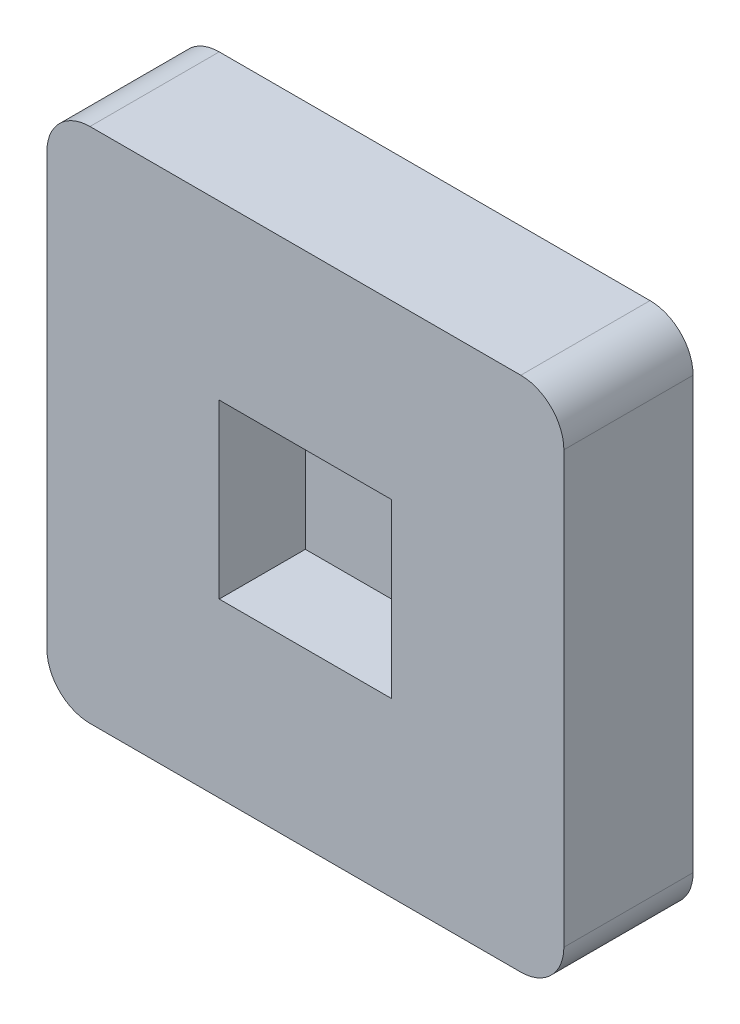
ISO-10303-21;
HEADER;
FILE_DESCRIPTION(('STEP AP214'),'2;1');
FILE_NAME('part.step','',(''),(''),'','','');
FILE_SCHEMA(('AUTOMOTIVE_DESIGN { 1 0 10303 214 1 1 1 1 }'));
ENDSEC;
DATA;
#1=APPLICATION_CONTEXT('core data for automotive mechanical design processes');
#2=APPLICATION_PROTOCOL_DEFINITION('international standard','automotive_design',2000,#1);
#3=PRODUCT_CONTEXT('',#1,'mechanical');
#4=PRODUCT('Part','Part','',(#3));
#5=PRODUCT_RELATED_PRODUCT_CATEGORY('part','',(#4));
#6=PRODUCT_DEFINITION_FORMATION('','',#4);
#7=PRODUCT_DEFINITION_CONTEXT('part definition',#1,'design');
#8=PRODUCT_DEFINITION('design','',#6,#7);
#9=PRODUCT_DEFINITION_SHAPE('','',#8);
#10=(LENGTH_UNIT() NAMED_UNIT(*) SI_UNIT(.MILLI.,.METRE.));
#11=(NAMED_UNIT(*) PLANE_ANGLE_UNIT() SI_UNIT($,.RADIAN.));
#12=(NAMED_UNIT(*) SI_UNIT($,.STERADIAN.) SOLID_ANGLE_UNIT());
#13=UNCERTAINTY_MEASURE_WITH_UNIT(LENGTH_MEASURE(1.E-05),#10,'distance_accuracy_value','');
#14=(GEOMETRIC_REPRESENTATION_CONTEXT(3) GLOBAL_UNCERTAINTY_ASSIGNED_CONTEXT((#13)) GLOBAL_UNIT_ASSIGNED_CONTEXT((#10,
#11,#12)) REPRESENTATION_CONTEXT('',''));
#15=CARTESIAN_POINT('',(0.,0.,0.));
#16=DIRECTION('',(0.,0.,1.));
#17=DIRECTION('',(1.,0.,0.));
#18=AXIS2_PLACEMENT_3D('',#15,#16,#17);
#19=CARTESIAN_POINT('',(6.,-6.,3.));
#20=DIRECTION('',(-1.,0.,0.));
#21=DIRECTION('',(0.,0.,1.));
#22=AXIS2_PLACEMENT_3D('',#19,#20,#21);
#23=PLANE('',#22);
#24=DIRECTION('',(0.,1.,0.));
#25=VECTOR('',#24,1.);
#26=CARTESIAN_POINT('',(6.,-6.,3.));
#27=LINE('',#26,#25);
#28=CARTESIAN_POINT('',(6.,-5.,3.));
#29=VERTEX_POINT('',#28);
#30=CARTESIAN_POINT('',(6.,5.,3.));
#31=VERTEX_POINT('',#30);
#32=EDGE_CURVE('E185',#29,#31,#27,.T.);
#33=ORIENTED_EDGE('',*,*,#32,.F.);
#34=DIRECTION('',(0.,0.,-1.));
#35=VECTOR('',#34,1.);
#36=CARTESIAN_POINT('',(6.,-5.,3.));
#37=LINE('',#36,#35);
#38=CARTESIAN_POINT('',(6.,-5.,0.));
#39=VERTEX_POINT('',#38);
#40=EDGE_CURVE('E216',#29,#39,#37,.T.);
#41=ORIENTED_EDGE('',*,*,#40,.T.);
#42=DIRECTION('',(0.,1.,0.));
#43=VECTOR('',#42,1.);
#44=CARTESIAN_POINT('',(6.,-6.,0.));
#45=LINE('',#44,#43);
#46=CARTESIAN_POINT('',(6.,5.,0.));
#47=VERTEX_POINT('',#46);
#48=EDGE_CURVE('E179',#39,#47,#45,.T.);
#49=ORIENTED_EDGE('',*,*,#48,.T.);
#50=DIRECTION('',(0.,0.,-1.));
#51=VECTOR('',#50,1.);
#52=CARTESIAN_POINT('',(6.,5.,3.));
#53=LINE('',#52,#51);
#54=EDGE_CURVE('E200',#47,#31,#53,.F.);
#55=ORIENTED_EDGE('',*,*,#54,.T.);
#56=EDGE_LOOP('',(#33,#41,#49,#55));
#57=FACE_BOUND('',#56,.T.);
#58=ADVANCED_FACE('F39',(#57),#23,.F.);
#59=CARTESIAN_POINT('',(-6.,6.,3.));
#60=DIRECTION('',(0.,-1.,0.));
#61=DIRECTION('',(0.,0.,-1.));
#62=AXIS2_PLACEMENT_3D('',#59,#60,#61);
#63=PLANE('',#62);
#64=DIRECTION('',(-1.,0.,0.));
#65=VECTOR('',#64,1.);
#66=CARTESIAN_POINT('',(-6.,6.,0.));
#67=LINE('',#66,#65);
#68=CARTESIAN_POINT('',(5.,6.,0.));
#69=VERTEX_POINT('',#68);
#70=CARTESIAN_POINT('',(-5.,6.,0.));
#71=VERTEX_POINT('',#70);
#72=EDGE_CURVE('E204',#69,#71,#67,.T.);
#73=ORIENTED_EDGE('',*,*,#72,.T.);
#74=DIRECTION('',(0.,0.,-1.));
#75=VECTOR('',#74,1.);
#76=CARTESIAN_POINT('',(-5.,6.,3.));
#77=LINE('',#76,#75);
#78=CARTESIAN_POINT('',(-5.,6.,3.));
#79=VERTEX_POINT('',#78);
#80=EDGE_CURVE('E11',#71,#79,#77,.F.);
#81=ORIENTED_EDGE('',*,*,#80,.T.);
#82=DIRECTION('',(-1.,0.,0.));
#83=VECTOR('',#82,1.);
#84=CARTESIAN_POINT('',(-6.,6.,3.));
#85=LINE('',#84,#83);
#86=CARTESIAN_POINT('',(5.,6.,3.));
#87=VERTEX_POINT('',#86);
#88=EDGE_CURVE('E189',#87,#79,#85,.T.);
#89=ORIENTED_EDGE('',*,*,#88,.F.);
#90=DIRECTION('',(0.,0.,-1.));
#91=VECTOR('',#90,1.);
#92=CARTESIAN_POINT('',(5.,6.,3.));
#93=LINE('',#92,#91);
#94=EDGE_CURVE('E48',#87,#69,#93,.T.);
#95=ORIENTED_EDGE('',*,*,#94,.T.);
#96=EDGE_LOOP('',(#73,#81,#89,#95));
#97=FACE_BOUND('',#96,.T.);
#98=ADVANCED_FACE('F261',(#97),#63,.F.);
#99=CARTESIAN_POINT('',(-6.,-6.,3.));
#100=DIRECTION('',(1.,0.,0.));
#101=DIRECTION('',(0.,0.,-1.));
#102=AXIS2_PLACEMENT_3D('',#99,#100,#101);
#103=PLANE('',#102);
#104=DIRECTION('',(0.,-1.,0.));
#105=VECTOR('',#104,1.);
#106=CARTESIAN_POINT('',(-6.,-6.,0.));
#107=LINE('',#106,#105);
#108=CARTESIAN_POINT('',(-6.,5.,0.));
#109=VERTEX_POINT('',#108);
#110=CARTESIAN_POINT('',(-6.,-5.,0.));
#111=VERTEX_POINT('',#110);
#112=EDGE_CURVE('E208',#109,#111,#107,.T.);
#113=ORIENTED_EDGE('',*,*,#112,.T.);
#114=DIRECTION('',(0.,0.,-1.));
#115=VECTOR('',#114,1.);
#116=CARTESIAN_POINT('',(-6.,-5.,3.));
#117=LINE('',#116,#115);
#118=CARTESIAN_POINT('',(-6.,-5.,3.));
#119=VERTEX_POINT('',#118);
#120=EDGE_CURVE('E55',#111,#119,#117,.F.);
#121=ORIENTED_EDGE('',*,*,#120,.T.);
#122=DIRECTION('',(0.,-1.,0.));
#123=VECTOR('',#122,1.);
#124=CARTESIAN_POINT('',(-6.,-6.,3.));
#125=LINE('',#124,#123);
#126=CARTESIAN_POINT('',(-6.,5.,3.));
#127=VERTEX_POINT('',#126);
#128=EDGE_CURVE('E193',#127,#119,#125,.T.);
#129=ORIENTED_EDGE('',*,*,#128,.F.);
#130=DIRECTION('',(0.,0.,-1.));
#131=VECTOR('',#130,1.);
#132=CARTESIAN_POINT('',(-6.,5.,3.));
#133=LINE('',#132,#131);
#134=EDGE_CURVE('E250',#127,#109,#133,.T.);
#135=ORIENTED_EDGE('',*,*,#134,.T.);
#136=EDGE_LOOP('',(#113,#121,#129,#135));
#137=FACE_BOUND('',#136,.T.);
#138=ADVANCED_FACE('F272',(#137),#103,.F.);
#139=CARTESIAN_POINT('',(-6.,-6.,3.));
#140=DIRECTION('',(0.,1.,0.));
#141=DIRECTION('',(0.,0.,1.));
#142=AXIS2_PLACEMENT_3D('',#139,#140,#141);
#143=PLANE('',#142);
#144=DIRECTION('',(1.,0.,0.));
#145=VECTOR('',#144,1.);
#146=CARTESIAN_POINT('',(-6.,-6.,0.));
#147=LINE('',#146,#145);
#148=CARTESIAN_POINT('',(-5.,-6.,0.));
#149=VERTEX_POINT('',#148);
#150=CARTESIAN_POINT('',(5.,-6.,0.));
#151=VERTEX_POINT('',#150);
#152=EDGE_CURVE('E190',#149,#151,#147,.T.);
#153=ORIENTED_EDGE('',*,*,#152,.T.);
#154=DIRECTION('',(0.,0.,-1.));
#155=VECTOR('',#154,1.);
#156=CARTESIAN_POINT('',(5.,-6.,3.));
#157=LINE('',#156,#155);
#158=CARTESIAN_POINT('',(5.,-6.,3.));
#159=VERTEX_POINT('',#158);
#160=EDGE_CURVE('E236',#151,#159,#157,.F.);
#161=ORIENTED_EDGE('',*,*,#160,.T.);
#162=DIRECTION('',(1.,0.,0.));
#163=VECTOR('',#162,1.);
#164=CARTESIAN_POINT('',(-6.,-6.,3.));
#165=LINE('',#164,#163);
#166=CARTESIAN_POINT('',(-5.,-6.,3.));
#167=VERTEX_POINT('',#166);
#168=EDGE_CURVE('E196',#167,#159,#165,.T.);
#169=ORIENTED_EDGE('',*,*,#168,.F.);
#170=DIRECTION('',(0.,0.,-1.));
#171=VECTOR('',#170,1.);
#172=CARTESIAN_POINT('',(-5.,-6.,3.));
#173=LINE('',#172,#171);
#174=EDGE_CURVE('E232',#167,#149,#173,.T.);
#175=ORIENTED_EDGE('',*,*,#174,.T.);
#176=EDGE_LOOP('',(#153,#161,#169,#175));
#177=FACE_BOUND('',#176,.T.);
#178=ADVANCED_FACE('F281',(#177),#143,.F.);
#179=CARTESIAN_POINT('',(0.,0.,3.));
#180=DIRECTION('',(0.,0.,-1.));
#181=DIRECTION('',(-1.,0.,0.));
#182=AXIS2_PLACEMENT_3D('',#179,#180,#181);
#183=PLANE('',#182);
#184=DIRECTION('',(-1.,0.,0.));
#185=VECTOR('',#184,1.);
#186=CARTESIAN_POINT('',(-2.,2.,3.));
#187=LINE('',#186,#185);
#188=CARTESIAN_POINT('',(2.,2.,3.));
#189=VERTEX_POINT('',#188);
#190=CARTESIAN_POINT('',(-2.,2.,3.));
#191=VERTEX_POINT('',#190);
#192=EDGE_CURVE('E170',#189,#191,#187,.T.);
#193=ORIENTED_EDGE('',*,*,#192,.F.);
#194=DIRECTION('',(0.,1.,0.));
#195=VECTOR('',#194,1.);
#196=CARTESIAN_POINT('',(2.,-2.,3.));
#197=LINE('',#196,#195);
#198=CARTESIAN_POINT('',(2.,-2.,3.));
#199=VERTEX_POINT('',#198);
#200=EDGE_CURVE('E137',#199,#189,#197,.T.);
#201=ORIENTED_EDGE('',*,*,#200,.F.);
#202=DIRECTION('',(1.,0.,0.));
#203=VECTOR('',#202,1.);
#204=CARTESIAN_POINT('',(-2.,-2.,3.));
#205=LINE('',#204,#203);
#206=CARTESIAN_POINT('',(-2.,-2.,3.));
#207=VERTEX_POINT('',#206);
#208=EDGE_CURVE('E157',#207,#199,#205,.T.);
#209=ORIENTED_EDGE('',*,*,#208,.F.);
#210=DIRECTION('',(0.,-1.,0.));
#211=VECTOR('',#210,1.);
#212=CARTESIAN_POINT('',(-2.,-2.,3.));
#213=LINE('',#212,#211);
#214=EDGE_CURVE('E161',#191,#207,#213,.T.);
#215=ORIENTED_EDGE('',*,*,#214,.F.);
#216=EDGE_LOOP('',(#193,#201,#209,#215));
#217=FACE_BOUND('',#216,.T.);
#218=ORIENTED_EDGE('',*,*,#168,.T.);
#219=CARTESIAN_POINT('',(5.,-5.,3.));
#220=DIRECTION('',(0.,0.,-1.));
#221=DIRECTION('',(-1.,0.,0.));
#222=AXIS2_PLACEMENT_3D('',#219,#220,#221);
#223=CIRCLE('',#222,1.);
#224=EDGE_CURVE('E247',#159,#29,#223,.F.);
#225=ORIENTED_EDGE('',*,*,#224,.T.);
#226=ORIENTED_EDGE('',*,*,#32,.T.);
#227=CARTESIAN_POINT('',(5.,5.,3.));
#228=DIRECTION('',(0.,0.,-1.));
#229=DIRECTION('',(-1.,0.,0.));
#230=AXIS2_PLACEMENT_3D('',#227,#228,#229);
#231=CIRCLE('',#230,1.);
#232=EDGE_CURVE('E239',#31,#87,#231,.F.);
#233=ORIENTED_EDGE('',*,*,#232,.T.);
#234=ORIENTED_EDGE('',*,*,#88,.T.);
#235=CARTESIAN_POINT('',(-5.,5.,3.));
#236=DIRECTION('',(0.,0.,-1.));
#237=DIRECTION('',(-1.,0.,0.));
#238=AXIS2_PLACEMENT_3D('',#235,#236,#237);
#239=CIRCLE('',#238,1.);
#240=EDGE_CURVE('E62',#79,#127,#239,.F.);
#241=ORIENTED_EDGE('',*,*,#240,.T.);
#242=ORIENTED_EDGE('',*,*,#128,.T.);
#243=CARTESIAN_POINT('',(-5.,-5.,3.));
#244=DIRECTION('',(0.,0.,-1.));
#245=DIRECTION('',(-1.,0.,0.));
#246=AXIS2_PLACEMENT_3D('',#243,#244,#245);
#247=CIRCLE('',#246,1.);
#248=EDGE_CURVE('E244',#119,#167,#247,.F.);
#249=ORIENTED_EDGE('',*,*,#248,.T.);
#250=EDGE_LOOP('',(#218,#225,#226,#233,#234,#241,#242,#249));
#251=FACE_BOUND('',#250,.T.);
#252=ADVANCED_FACE('F274',(#217,#251),#183,.F.);
#253=CARTESIAN_POINT('',(0.,0.,0.));
#254=DIRECTION('',(0.,0.,-1.));
#255=DIRECTION('',(-1.,0.,0.));
#256=AXIS2_PLACEMENT_3D('',#253,#254,#255);
#257=PLANE('',#256);
#258=ORIENTED_EDGE('',*,*,#48,.F.);
#259=CARTESIAN_POINT('',(5.,-5.,0.));
#260=DIRECTION('',(0.,0.,-1.));
#261=DIRECTION('',(-1.,0.,0.));
#262=AXIS2_PLACEMENT_3D('',#259,#260,#261);
#263=CIRCLE('',#262,1.);
#264=EDGE_CURVE('E229',#39,#151,#263,.T.);
#265=ORIENTED_EDGE('',*,*,#264,.T.);
#266=ORIENTED_EDGE('',*,*,#152,.F.);
#267=CARTESIAN_POINT('',(-5.,-5.,0.));
#268=DIRECTION('',(0.,0.,-1.));
#269=DIRECTION('',(-1.,0.,0.));
#270=AXIS2_PLACEMENT_3D('',#267,#268,#269);
#271=CIRCLE('',#270,1.);
#272=EDGE_CURVE('E226',#149,#111,#271,.T.);
#273=ORIENTED_EDGE('',*,*,#272,.T.);
#274=ORIENTED_EDGE('',*,*,#112,.F.);
#275=CARTESIAN_POINT('',(-5.,5.,0.));
#276=DIRECTION('',(0.,0.,-1.));
#277=DIRECTION('',(-1.,0.,0.));
#278=AXIS2_PLACEMENT_3D('',#275,#276,#277);
#279=CIRCLE('',#278,1.);
#280=EDGE_CURVE('E223',#109,#71,#279,.T.);
#281=ORIENTED_EDGE('',*,*,#280,.T.);
#282=ORIENTED_EDGE('',*,*,#72,.F.);
#283=CARTESIAN_POINT('',(5.,5.,0.));
#284=DIRECTION('',(0.,0.,-1.));
#285=DIRECTION('',(-1.,0.,0.));
#286=AXIS2_PLACEMENT_3D('',#283,#284,#285);
#287=CIRCLE('',#286,1.);
#288=EDGE_CURVE('E220',#69,#47,#287,.T.);
#289=ORIENTED_EDGE('',*,*,#288,.T.);
#290=EDGE_LOOP('',(#258,#265,#266,#273,#274,#281,#282,#289));
#291=FACE_BOUND('',#290,.T.);
#292=ADVANCED_FACE('F267',(#291),#257,.T.);
#293=CARTESIAN_POINT('',(2.,-2.,1.));
#294=DIRECTION('',(1.,0.,0.));
#295=DIRECTION('',(0.,0.,-1.));
#296=AXIS2_PLACEMENT_3D('',#293,#294,#295);
#297=PLANE('',#296);
#298=ORIENTED_EDGE('',*,*,#200,.T.);
#299=DIRECTION('',(0.,0.,1.));
#300=VECTOR('',#299,1.);
#301=CARTESIAN_POINT('',(2.,2.,1.));
#302=LINE('',#301,#300);
#303=CARTESIAN_POINT('',(2.,2.,1.));
#304=VERTEX_POINT('',#303);
#305=EDGE_CURVE('E130',#304,#189,#302,.T.);
#306=ORIENTED_EDGE('',*,*,#305,.F.);
#307=DIRECTION('',(0.,1.,0.));
#308=VECTOR('',#307,1.);
#309=CARTESIAN_POINT('',(2.,-2.,1.));
#310=LINE('',#309,#308);
#311=CARTESIAN_POINT('',(2.,-2.,1.));
#312=VERTEX_POINT('',#311);
#313=EDGE_CURVE('E134',#312,#304,#310,.T.);
#314=ORIENTED_EDGE('',*,*,#313,.F.);
#315=DIRECTION('',(0.,0.,1.));
#316=VECTOR('',#315,1.);
#317=CARTESIAN_POINT('',(2.,-2.,1.));
#318=LINE('',#317,#316);
#319=EDGE_CURVE('E176',#312,#199,#318,.T.);
#320=ORIENTED_EDGE('',*,*,#319,.T.);
#321=EDGE_LOOP('',(#298,#306,#314,#320));
#322=FACE_BOUND('',#321,.T.);
#323=ADVANCED_FACE('F132',(#322),#297,.F.);
#324=CARTESIAN_POINT('',(-2.,-2.,1.));
#325=DIRECTION('',(0.,-1.,0.));
#326=DIRECTION('',(0.,0.,-1.));
#327=AXIS2_PLACEMENT_3D('',#324,#325,#326);
#328=PLANE('',#327);
#329=ORIENTED_EDGE('',*,*,#208,.T.);
#330=ORIENTED_EDGE('',*,*,#319,.F.);
#331=DIRECTION('',(1.,0.,0.));
#332=VECTOR('',#331,1.);
#333=CARTESIAN_POINT('',(-2.,-2.,1.));
#334=LINE('',#333,#332);
#335=CARTESIAN_POINT('',(-2.,-2.,1.));
#336=VERTEX_POINT('',#335);
#337=EDGE_CURVE('E143',#336,#312,#334,.T.);
#338=ORIENTED_EDGE('',*,*,#337,.F.);
#339=DIRECTION('',(0.,0.,1.));
#340=VECTOR('',#339,1.);
#341=CARTESIAN_POINT('',(-2.,-2.,1.));
#342=LINE('',#341,#340);
#343=EDGE_CURVE('E180',#336,#207,#342,.T.);
#344=ORIENTED_EDGE('',*,*,#343,.T.);
#345=EDGE_LOOP('',(#329,#330,#338,#344));
#346=FACE_BOUND('',#345,.T.);
#347=ADVANCED_FACE('F349',(#346),#328,.F.);
#348=CARTESIAN_POINT('',(-2.,-2.,1.));
#349=DIRECTION('',(-1.,0.,0.));
#350=DIRECTION('',(0.,0.,1.));
#351=AXIS2_PLACEMENT_3D('',#348,#349,#350);
#352=PLANE('',#351);
#353=ORIENTED_EDGE('',*,*,#214,.T.);
#354=ORIENTED_EDGE('',*,*,#343,.F.);
#355=DIRECTION('',(0.,-1.,0.));
#356=VECTOR('',#355,1.);
#357=CARTESIAN_POINT('',(-2.,-2.,1.));
#358=LINE('',#357,#356);
#359=CARTESIAN_POINT('',(-2.,2.,1.));
#360=VERTEX_POINT('',#359);
#361=EDGE_CURVE('E152',#360,#336,#358,.T.);
#362=ORIENTED_EDGE('',*,*,#361,.F.);
#363=DIRECTION('',(0.,0.,1.));
#364=VECTOR('',#363,1.);
#365=CARTESIAN_POINT('',(-2.,2.,1.));
#366=LINE('',#365,#364);
#367=EDGE_CURVE('E142',#360,#191,#366,.T.);
#368=ORIENTED_EDGE('',*,*,#367,.T.);
#369=EDGE_LOOP('',(#353,#354,#362,#368));
#370=FACE_BOUND('',#369,.T.);
#371=ADVANCED_FACE('F341',(#370),#352,.F.);
#372=CARTESIAN_POINT('',(-2.,2.,1.));
#373=DIRECTION('',(0.,1.,0.));
#374=DIRECTION('',(0.,0.,1.));
#375=AXIS2_PLACEMENT_3D('',#372,#373,#374);
#376=PLANE('',#375);
#377=ORIENTED_EDGE('',*,*,#192,.T.);
#378=ORIENTED_EDGE('',*,*,#367,.F.);
#379=DIRECTION('',(-1.,0.,0.));
#380=VECTOR('',#379,1.);
#381=CARTESIAN_POINT('',(-2.,2.,1.));
#382=LINE('',#381,#380);
#383=EDGE_CURVE('E146',#304,#360,#382,.T.);
#384=ORIENTED_EDGE('',*,*,#383,.F.);
#385=ORIENTED_EDGE('',*,*,#305,.T.);
#386=EDGE_LOOP('',(#377,#378,#384,#385));
#387=FACE_BOUND('',#386,.T.);
#388=ADVANCED_FACE('F147',(#387),#376,.F.);
#389=CARTESIAN_POINT('',(0.,0.,1.));
#390=DIRECTION('',(0.,0.,-1.));
#391=DIRECTION('',(-1.,0.,0.));
#392=AXIS2_PLACEMENT_3D('',#389,#390,#391);
#393=PLANE('',#392);
#394=ORIENTED_EDGE('',*,*,#313,.T.);
#395=ORIENTED_EDGE('',*,*,#383,.T.);
#396=ORIENTED_EDGE('',*,*,#361,.T.);
#397=ORIENTED_EDGE('',*,*,#337,.T.);
#398=EDGE_LOOP('',(#394,#395,#396,#397));
#399=FACE_BOUND('',#398,.T.);
#400=ADVANCED_FACE('F154',(#399),#393,.F.);
#401=CARTESIAN_POINT('',(5.,-5.,3.));
#402=DIRECTION('',(0.,0.,-1.));
#403=DIRECTION('',(-1.,0.,0.));
#404=AXIS2_PLACEMENT_3D('',#401,#402,#403);
#405=CYLINDRICAL_SURFACE('',#404,1.);
#406=ORIENTED_EDGE('',*,*,#224,.F.);
#407=ORIENTED_EDGE('',*,*,#160,.F.);
#408=ORIENTED_EDGE('',*,*,#264,.F.);
#409=ORIENTED_EDGE('',*,*,#40,.F.);
#410=EDGE_LOOP('',(#406,#407,#408,#409));
#411=FACE_BOUND('',#410,.T.);
#412=ADVANCED_FACE('F286',(#411),#405,.T.);
#413=CARTESIAN_POINT('',(-5.,-5.,3.));
#414=DIRECTION('',(0.,0.,-1.));
#415=DIRECTION('',(-1.,0.,0.));
#416=AXIS2_PLACEMENT_3D('',#413,#414,#415);
#417=CYLINDRICAL_SURFACE('',#416,1.);
#418=ORIENTED_EDGE('',*,*,#248,.F.);
#419=ORIENTED_EDGE('',*,*,#120,.F.);
#420=ORIENTED_EDGE('',*,*,#272,.F.);
#421=ORIENTED_EDGE('',*,*,#174,.F.);
#422=EDGE_LOOP('',(#418,#419,#420,#421));
#423=FACE_BOUND('',#422,.T.);
#424=ADVANCED_FACE('F278',(#423),#417,.T.);
#425=CARTESIAN_POINT('',(-5.,5.,3.));
#426=DIRECTION('',(0.,0.,-1.));
#427=DIRECTION('',(-1.,0.,0.));
#428=AXIS2_PLACEMENT_3D('',#425,#426,#427);
#429=CYLINDRICAL_SURFACE('',#428,1.);
#430=ORIENTED_EDGE('',*,*,#240,.F.);
#431=ORIENTED_EDGE('',*,*,#80,.F.);
#432=ORIENTED_EDGE('',*,*,#280,.F.);
#433=ORIENTED_EDGE('',*,*,#134,.F.);
#434=EDGE_LOOP('',(#430,#431,#432,#433));
#435=FACE_BOUND('',#434,.T.);
#436=ADVANCED_FACE('F271',(#435),#429,.T.);
#437=CARTESIAN_POINT('',(5.,5.,3.));
#438=DIRECTION('',(0.,0.,-1.));
#439=DIRECTION('',(-1.,0.,0.));
#440=AXIS2_PLACEMENT_3D('',#437,#438,#439);
#441=CYLINDRICAL_SURFACE('',#440,1.);
#442=ORIENTED_EDGE('',*,*,#232,.F.);
#443=ORIENTED_EDGE('',*,*,#54,.F.);
#444=ORIENTED_EDGE('',*,*,#288,.F.);
#445=ORIENTED_EDGE('',*,*,#94,.F.);
#446=EDGE_LOOP('',(#442,#443,#444,#445));
#447=FACE_BOUND('',#446,.T.);
#448=ADVANCED_FACE('F41',(#447),#441,.T.);
#449=CLOSED_SHELL('',(#58,#98,#138,#178,#252,#292,#323,#347,#371,#388,#400,#412,#424,#436,#448));
#450=MANIFOLD_SOLID_BREP('B2',#449);
#451=ADVANCED_BREP_SHAPE_REPRESENTATION('',(#18,#450),#14);
#452=SHAPE_DEFINITION_REPRESENTATION(#9,#451);
ENDSEC;
END-ISO-10303-21;
